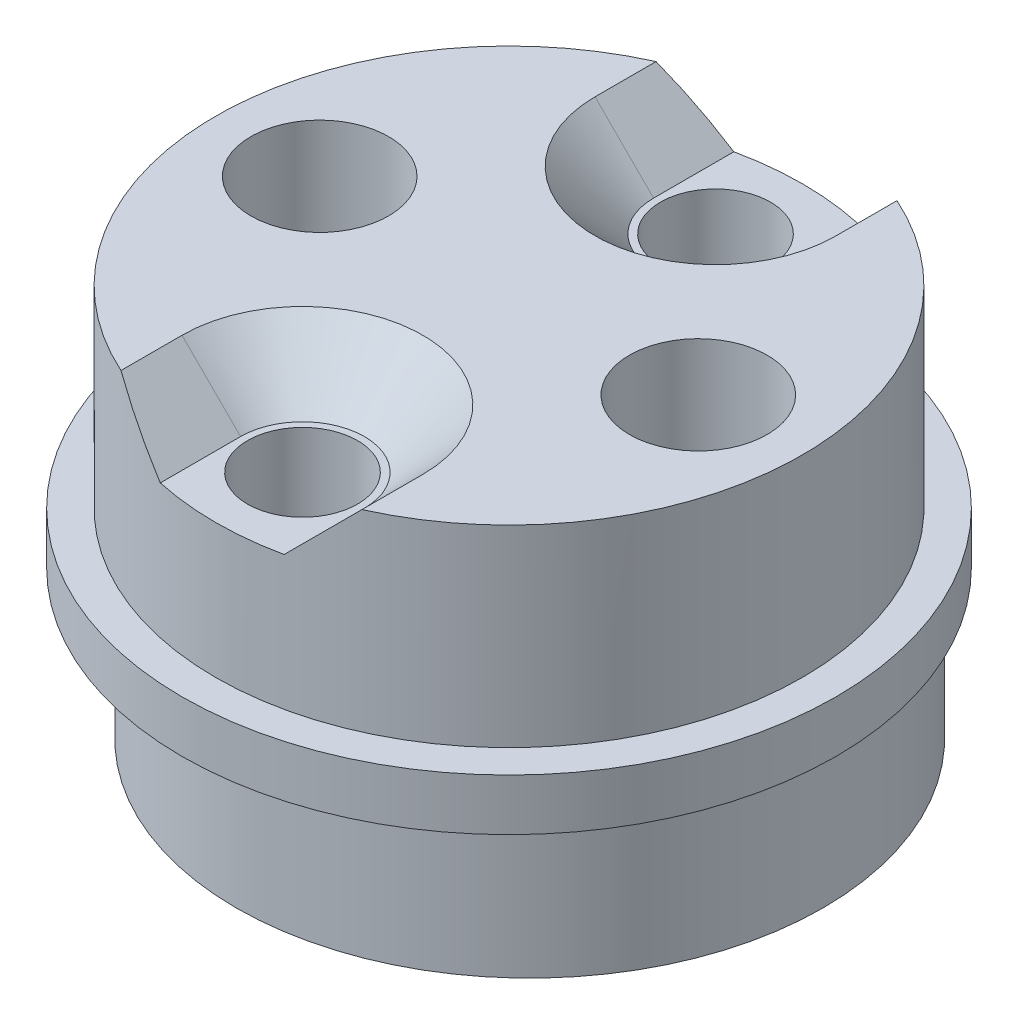
ISO-10303-21;
HEADER;
FILE_DESCRIPTION(('STEP AP214'),'2;1');
FILE_NAME('part.step','',(''),(''),'','','');
FILE_SCHEMA(('AUTOMOTIVE_DESIGN { 1 0 10303 214 1 1 1 1 }'));
ENDSEC;
DATA;
#1=APPLICATION_CONTEXT('core data for automotive mechanical design processes');
#2=APPLICATION_PROTOCOL_DEFINITION('international standard','automotive_design',2000,#1);
#3=PRODUCT_CONTEXT('',#1,'mechanical');
#4=PRODUCT('Part','Part','',(#3));
#5=PRODUCT_RELATED_PRODUCT_CATEGORY('part','',(#4));
#6=PRODUCT_DEFINITION_FORMATION('','',#4);
#7=PRODUCT_DEFINITION_CONTEXT('part definition',#1,'design');
#8=PRODUCT_DEFINITION('design','',#6,#7);
#9=PRODUCT_DEFINITION_SHAPE('','',#8);
#10=(LENGTH_UNIT() NAMED_UNIT(*) SI_UNIT(.MILLI.,.METRE.));
#11=(NAMED_UNIT(*) PLANE_ANGLE_UNIT() SI_UNIT($,.RADIAN.));
#12=(NAMED_UNIT(*) SI_UNIT($,.STERADIAN.) SOLID_ANGLE_UNIT());
#13=UNCERTAINTY_MEASURE_WITH_UNIT(LENGTH_MEASURE(1.E-05),#10,'distance_accuracy_value','');
#14=(GEOMETRIC_REPRESENTATION_CONTEXT(3) GLOBAL_UNCERTAINTY_ASSIGNED_CONTEXT((#13)) GLOBAL_UNIT_ASSIGNED_CONTEXT((#10,
#11,#12)) REPRESENTATION_CONTEXT('',''));
#15=CARTESIAN_POINT('',(0.,0.,0.));
#16=DIRECTION('',(0.,0.,1.));
#17=DIRECTION('',(1.,0.,0.));
#18=AXIS2_PLACEMENT_3D('',#15,#16,#17);
#19=CARTESIAN_POINT('',(1.2,4.,0.));
#20=DIRECTION('',(0.,1.,0.));
#21=DIRECTION('',(0.,0.,1.));
#22=AXIS2_PLACEMENT_3D('',#19,#20,#21);
#23=PLANE('',#22);
#24=CARTESIAN_POINT('',(6.1,4.,0.));
#25=DIRECTION('',(0.,1.,0.));
#26=DIRECTION('',(0.,0.,1.));
#27=AXIS2_PLACEMENT_3D('',#24,#25,#26);
#28=CIRCLE('',#27,1.55);
#29=CARTESIAN_POINT('',(6.1,4.,1.55));
#30=VERTEX_POINT('',#29);
#31=EDGE_CURVE('E189',#30,#30,#28,.F.);
#32=ORIENTED_EDGE('',*,*,#31,.F.);
#33=EDGE_LOOP('',(#32));
#34=FACE_BOUND('',#33,.T.);
#35=CARTESIAN_POINT('',(0.6,4.,6.));
#36=DIRECTION('',(0.,1.,0.));
#37=DIRECTION('',(0.,0.,1.));
#38=AXIS2_PLACEMENT_3D('',#35,#36,#37);
#39=CIRCLE('',#38,1.6);
#40=CARTESIAN_POINT('',(0.6,4.,7.6));
#41=VERTEX_POINT('',#40);
#42=EDGE_CURVE('E183',#41,#41,#39,.F.);
#43=ORIENTED_EDGE('',*,*,#42,.F.);
#44=EDGE_LOOP('',(#43));
#45=FACE_BOUND('',#44,.T.);
#46=CARTESIAN_POINT('',(0.6,4.,-6.));
#47=DIRECTION('',(0.,1.,0.));
#48=DIRECTION('',(0.,0.,1.));
#49=AXIS2_PLACEMENT_3D('',#46,#47,#48);
#50=CIRCLE('',#49,1.6);
#51=CARTESIAN_POINT('',(0.6,4.,-4.4));
#52=VERTEX_POINT('',#51);
#53=EDGE_CURVE('E180',#52,#52,#50,.F.);
#54=ORIENTED_EDGE('',*,*,#53,.F.);
#55=EDGE_LOOP('',(#54));
#56=FACE_BOUND('',#55,.T.);
#57=CARTESIAN_POINT('',(-4.9,4.,0.));
#58=DIRECTION('',(0.,1.,0.));
#59=DIRECTION('',(0.,0.,1.));
#60=AXIS2_PLACEMENT_3D('',#57,#58,#59);
#61=CIRCLE('',#60,1.55);
#62=CARTESIAN_POINT('',(-4.9,4.,1.55));
#63=VERTEX_POINT('',#62);
#64=EDGE_CURVE('E186',#63,#63,#61,.F.);
#65=ORIENTED_EDGE('',*,*,#64,.F.);
#66=EDGE_LOOP('',(#65));
#67=FACE_BOUND('',#66,.T.);
#68=CARTESIAN_POINT('',(1.2,4.,0.));
#69=DIRECTION('',(0.,1.,0.));
#70=DIRECTION('',(0.,0.,1.));
#71=AXIS2_PLACEMENT_3D('',#68,#69,#70);
#72=CIRCLE('',#71,8.525);
#73=CARTESIAN_POINT('',(1.2,4.,8.525));
#74=VERTEX_POINT('',#73);
#75=EDGE_CURVE('E243',#74,#74,#72,.T.);
#76=ORIENTED_EDGE('',*,*,#75,.F.);
#77=EDGE_LOOP('',(#76));
#78=FACE_BOUND('',#77,.T.);
#79=DIRECTION('',(0.,0.,-1.));
#80=VECTOR('',#79,1.);
#81=CARTESIAN_POINT('',(-1.8,4.,3.));
#82=LINE('',#81,#80);
#83=CARTESIAN_POINT('',(-1.8,4.,3.));
#84=VERTEX_POINT('',#83);
#85=CARTESIAN_POINT('',(-1.8,4.,-3.));
#86=VERTEX_POINT('',#85);
#87=EDGE_CURVE('E170',#84,#86,#82,.T.);
#88=ORIENTED_EDGE('',*,*,#87,.F.);
#89=DIRECTION('',(-1.,0.,0.));
#90=VECTOR('',#89,1.);
#91=CARTESIAN_POINT('',(-1.8,4.,3.));
#92=LINE('',#91,#90);
#93=CARTESIAN_POINT('',(4.2,4.,3.));
#94=VERTEX_POINT('',#93);
#95=EDGE_CURVE('E166',#94,#84,#92,.T.);
#96=ORIENTED_EDGE('',*,*,#95,.F.);
#97=DIRECTION('',(0.,0.,1.));
#98=VECTOR('',#97,1.);
#99=CARTESIAN_POINT('',(4.2,4.,3.));
#100=LINE('',#99,#98);
#101=CARTESIAN_POINT('',(4.2,4.,-3.));
#102=VERTEX_POINT('',#101);
#103=EDGE_CURVE('E150',#102,#94,#100,.T.);
#104=ORIENTED_EDGE('',*,*,#103,.F.);
#105=DIRECTION('',(1.,0.,0.));
#106=VECTOR('',#105,1.);
#107=CARTESIAN_POINT('',(-1.8,4.,-3.));
#108=LINE('',#107,#106);
#109=EDGE_CURVE('E163',#86,#102,#108,.T.);
#110=ORIENTED_EDGE('',*,*,#109,.F.);
#111=EDGE_LOOP('',(#88,#96,#104,#110));
#112=FACE_BOUND('',#111,.T.);
#113=ADVANCED_FACE('F41',(#34,#45,#56,#67,#78,#112),#23,.F.);
#114=CARTESIAN_POINT('',(6.1,19.4840620433566,0.));
#115=DIRECTION('',(0.,-1.,0.));
#116=DIRECTION('',(0.,0.,-1.));
#117=AXIS2_PLACEMENT_3D('',#114,#115,#116);
#118=CYLINDRICAL_SURFACE('',#117,1.55);
#119=ORIENTED_EDGE('',*,*,#31,.T.);
#120=EDGE_LOOP('',(#119));
#121=FACE_BOUND('',#120,.T.);
#122=CARTESIAN_POINT('',(6.1,11.1,0.));
#123=DIRECTION('',(0.,1.,0.));
#124=DIRECTION('',(0.,0.,1.));
#125=AXIS2_PLACEMENT_3D('',#122,#123,#124);
#126=CIRCLE('',#125,1.55);
#127=CARTESIAN_POINT('',(6.1,11.1,1.55));
#128=VERTEX_POINT('',#127);
#129=EDGE_CURVE('E252',#128,#128,#126,.F.);
#130=ORIENTED_EDGE('',*,*,#129,.F.);
#131=EDGE_LOOP('',(#130));
#132=FACE_BOUND('',#131,.T.);
#133=ADVANCED_FACE('F353',(#121,#132),#118,.F.);
#134=CARTESIAN_POINT('',(-4.9,19.4840620433566,0.));
#135=DIRECTION('',(0.,-1.,0.));
#136=DIRECTION('',(0.,0.,-1.));
#137=AXIS2_PLACEMENT_3D('',#134,#135,#136);
#138=CYLINDRICAL_SURFACE('',#137,1.55);
#139=ORIENTED_EDGE('',*,*,#64,.T.);
#140=EDGE_LOOP('',(#139));
#141=FACE_BOUND('',#140,.T.);
#142=CARTESIAN_POINT('',(-4.9,11.1,0.));
#143=DIRECTION('',(0.,1.,0.));
#144=DIRECTION('',(0.,0.,1.));
#145=AXIS2_PLACEMENT_3D('',#142,#143,#144);
#146=CIRCLE('',#145,1.55);
#147=CARTESIAN_POINT('',(-4.9,11.1,1.55));
#148=VERTEX_POINT('',#147);
#149=EDGE_CURVE('E221',#148,#148,#146,.F.);
#150=ORIENTED_EDGE('',*,*,#149,.F.);
#151=EDGE_LOOP('',(#150));
#152=FACE_BOUND('',#151,.T.);
#153=ADVANCED_FACE('F361',(#141,#152),#138,.F.);
#154=CARTESIAN_POINT('',(0.6,19.6254833995939,6.));
#155=DIRECTION('',(0.,-1.,0.));
#156=DIRECTION('',(0.,0.,-1.));
#157=AXIS2_PLACEMENT_3D('',#154,#155,#156);
#158=CYLINDRICAL_SURFACE('',#157,1.6);
#159=ORIENTED_EDGE('',*,*,#42,.T.);
#160=EDGE_LOOP('',(#159));
#161=FACE_BOUND('',#160,.T.);
#162=CARTESIAN_POINT('',(0.6,13.4,6.));
#163=DIRECTION('',(0.,1.,0.));
#164=DIRECTION('',(0.,0.,1.));
#165=AXIS2_PLACEMENT_3D('',#162,#163,#164);
#166=CIRCLE('',#165,1.6);
#167=CARTESIAN_POINT('',(0.6,13.4,7.6));
#168=VERTEX_POINT('',#167);
#169=EDGE_CURVE('E213',#168,#168,#166,.F.);
#170=ORIENTED_EDGE('',*,*,#169,.F.);
#171=EDGE_LOOP('',(#170));
#172=FACE_BOUND('',#171,.T.);
#173=ADVANCED_FACE('F521',(#161,#172),#158,.F.);
#174=CARTESIAN_POINT('',(0.6,19.6254833995939,-6.));
#175=DIRECTION('',(0.,-1.,0.));
#176=DIRECTION('',(0.,0.,-1.));
#177=AXIS2_PLACEMENT_3D('',#174,#175,#176);
#178=CYLINDRICAL_SURFACE('',#177,1.6);
#179=ORIENTED_EDGE('',*,*,#53,.T.);
#180=EDGE_LOOP('',(#179));
#181=FACE_BOUND('',#180,.T.);
#182=CARTESIAN_POINT('',(0.6,13.4,-6.));
#183=DIRECTION('',(0.,1.,0.));
#184=DIRECTION('',(0.,0.,1.));
#185=AXIS2_PLACEMENT_3D('',#182,#183,#184);
#186=CIRCLE('',#185,1.6);
#187=CARTESIAN_POINT('',(0.6,13.4,-4.4));
#188=VERTEX_POINT('',#187);
#189=EDGE_CURVE('E203',#188,#188,#186,.F.);
#190=ORIENTED_EDGE('',*,*,#189,.F.);
#191=EDGE_LOOP('',(#190));
#192=FACE_BOUND('',#191,.T.);
#193=ADVANCED_FACE('F372',(#181,#192),#178,.F.);
#194=CARTESIAN_POINT('',(1.2,8.,0.));
#195=DIRECTION('',(0.,-1.,0.));
#196=DIRECTION('',(0.,0.,-1.));
#197=AXIS2_PLACEMENT_3D('',#194,#195,#196);
#198=CYLINDRICAL_SURFACE('',#197,8.525);
#199=CARTESIAN_POINT('',(1.2,8.,0.));
#200=DIRECTION('',(0.,1.,0.));
#201=DIRECTION('',(0.,0.,1.));
#202=AXIS2_PLACEMENT_3D('',#199,#200,#201);
#203=CIRCLE('',#202,8.525);
#204=CARTESIAN_POINT('',(1.2,8.,8.525));
#205=VERTEX_POINT('',#204);
#206=EDGE_CURVE('E239',#205,#205,#203,.T.);
#207=ORIENTED_EDGE('',*,*,#206,.F.);
#208=EDGE_LOOP('',(#207));
#209=FACE_BOUND('',#208,.T.);
#210=ORIENTED_EDGE('',*,*,#75,.T.);
#211=EDGE_LOOP('',(#210));
#212=FACE_BOUND('',#211,.T.);
#213=ADVANCED_FACE('F370',(#209,#212),#198,.T.);
#214=CARTESIAN_POINT('',(0.6,9.5,0.));
#215=DIRECTION('',(0.,-1.,0.));
#216=DIRECTION('',(0.,0.,-1.));
#217=AXIS2_PLACEMENT_3D('',#214,#215,#216);
#218=CYLINDRICAL_SURFACE('',#217,9.5);
#219=CARTESIAN_POINT('',(0.6,9.5,0.));
#220=DIRECTION('',(0.,1.,0.));
#221=DIRECTION('',(0.,0.,1.));
#222=AXIS2_PLACEMENT_3D('',#219,#220,#221);
#223=CIRCLE('',#222,9.5);
#224=CARTESIAN_POINT('',(0.6,9.5,9.5));
#225=VERTEX_POINT('',#224);
#226=EDGE_CURVE('E240',#225,#225,#223,.T.);
#227=ORIENTED_EDGE('',*,*,#226,.F.);
#228=EDGE_LOOP('',(#227));
#229=FACE_BOUND('',#228,.T.);
#230=CARTESIAN_POINT('',(0.6,8.,0.));
#231=DIRECTION('',(0.,1.,0.));
#232=DIRECTION('',(0.,0.,1.));
#233=AXIS2_PLACEMENT_3D('',#230,#231,#232);
#234=CIRCLE('',#233,9.5);
#235=CARTESIAN_POINT('',(0.6,8.,9.5));
#236=VERTEX_POINT('',#235);
#237=EDGE_CURVE('E233',#236,#236,#234,.T.);
#238=ORIENTED_EDGE('',*,*,#237,.T.);
#239=EDGE_LOOP('',(#238));
#240=FACE_BOUND('',#239,.T.);
#241=ADVANCED_FACE('F368',(#229,#240),#218,.T.);
#242=CARTESIAN_POINT('',(0.6,9.5,0.));
#243=DIRECTION('',(0.,1.,0.));
#244=DIRECTION('',(0.,0.,1.));
#245=AXIS2_PLACEMENT_3D('',#242,#243,#244);
#246=PLANE('',#245);
#247=CARTESIAN_POINT('',(0.6,9.5,0.));
#248=DIRECTION('',(0.,1.,0.));
#249=DIRECTION('',(0.,0.,1.));
#250=AXIS2_PLACEMENT_3D('',#247,#248,#249);
#251=CIRCLE('',#250,8.525);
#252=CARTESIAN_POINT('',(0.6,9.5,8.525));
#253=VERTEX_POINT('',#252);
#254=EDGE_CURVE('E235',#253,#253,#251,.T.);
#255=ORIENTED_EDGE('',*,*,#254,.F.);
#256=EDGE_LOOP('',(#255));
#257=FACE_BOUND('',#256,.T.);
#258=ORIENTED_EDGE('',*,*,#226,.T.);
#259=EDGE_LOOP('',(#258));
#260=FACE_BOUND('',#259,.T.);
#261=ADVANCED_FACE('F611',(#257,#260),#246,.T.);
#262=CARTESIAN_POINT('',(0.6,8.,0.));
#263=DIRECTION('',(0.,1.,0.));
#264=DIRECTION('',(0.,0.,1.));
#265=AXIS2_PLACEMENT_3D('',#262,#263,#264);
#266=PLANE('',#265);
#267=ORIENTED_EDGE('',*,*,#206,.T.);
#268=EDGE_LOOP('',(#267));
#269=FACE_BOUND('',#268,.T.);
#270=ORIENTED_EDGE('',*,*,#237,.F.);
#271=EDGE_LOOP('',(#270));
#272=FACE_BOUND('',#271,.T.);
#273=ADVANCED_FACE('F603',(#269,#272),#266,.F.);
#274=CARTESIAN_POINT('',(0.6,15.1,0.));
#275=DIRECTION('',(0.,-1.,0.));
#276=DIRECTION('',(0.,0.,-1.));
#277=AXIS2_PLACEMENT_3D('',#274,#275,#276);
#278=CYLINDRICAL_SURFACE('',#277,8.525);
#279=CARTESIAN_POINT('',(0.6,15.1,0.));
#280=DIRECTION('',(0.,1.,0.));
#281=DIRECTION('',(0.,0.,1.));
#282=AXIS2_PLACEMENT_3D('',#279,#280,#281);
#283=CIRCLE('',#282,8.525);
#284=CARTESIAN_POINT('',(4.1,15.1,7.77339211670169));
#285=VERTEX_POINT('',#284);
#286=CARTESIAN_POINT('',(4.1,15.1,-7.77339211670169));
#287=VERTEX_POINT('',#286);
#288=EDGE_CURVE('E230',#285,#287,#283,.T.);
#289=ORIENTED_EDGE('',*,*,#288,.F.);
#290=CARTESIAN_POINT('',(0.6,11.6,0.));
#291=DIRECTION('',(0.707106781186543,-0.707106781186552,0.));
#292=DIRECTION('',(-0.707106781186552,-0.707106781186543,0.));
#293=AXIS2_PLACEMENT_3D('',#290,#291,#292);
#294=ELLIPSE('',#293,12.0561706192306,8.525);
#295=CARTESIAN_POINT('',(2.39999999999998,13.4,8.33280414986456));
#296=VERTEX_POINT('',#295);
#297=EDGE_CURVE('E297',#285,#296,#294,.T.);
#298=ORIENTED_EDGE('',*,*,#297,.T.);
#299=CARTESIAN_POINT('',(0.6,13.4,0.));
#300=DIRECTION('',(0.,1.,0.));
#301=DIRECTION('',(0.,0.,1.));
#302=AXIS2_PLACEMENT_3D('',#299,#300,#301);
#303=CIRCLE('',#302,8.525);
#304=CARTESIAN_POINT('',(-1.19999999999998,13.4,8.33280414986456));
#305=VERTEX_POINT('',#304);
#306=EDGE_CURVE('E214',#305,#296,#303,.T.);
#307=ORIENTED_EDGE('',*,*,#306,.F.);
#308=CARTESIAN_POINT('',(0.6,11.6,0.));
#309=DIRECTION('',(-0.707106781186543,-0.707106781186552,0.));
#310=DIRECTION('',(0.707106781186552,-0.707106781186543,0.));
#311=AXIS2_PLACEMENT_3D('',#308,#309,#310);
#312=ELLIPSE('',#311,12.0561706192306,8.525);
#313=CARTESIAN_POINT('',(-2.9,15.1,7.77339211670169));
#314=VERTEX_POINT('',#313);
#315=EDGE_CURVE('E299',#305,#314,#312,.T.);
#316=ORIENTED_EDGE('',*,*,#315,.T.);
#317=CARTESIAN_POINT('',(-2.9,15.1,-7.77339211670169));
#318=VERTEX_POINT('',#317);
#319=EDGE_CURVE('E234',#318,#314,#283,.T.);
#320=ORIENTED_EDGE('',*,*,#319,.F.);
#321=CARTESIAN_POINT('',(0.6,11.6,0.));
#322=DIRECTION('',(-0.707106781186543,-0.707106781186552,0.));
#323=DIRECTION('',(0.707106781186552,-0.707106781186543,0.));
#324=AXIS2_PLACEMENT_3D('',#321,#322,#323);
#325=ELLIPSE('',#324,12.0561706192306,8.525);
#326=CARTESIAN_POINT('',(-1.19999999999998,13.4,-8.33280414986456));
#327=VERTEX_POINT('',#326);
#328=EDGE_CURVE('E51',#318,#327,#325,.T.);
#329=ORIENTED_EDGE('',*,*,#328,.T.);
#330=CARTESIAN_POINT('',(0.6,13.4,0.));
#331=DIRECTION('',(0.,1.,0.));
#332=DIRECTION('',(0.,0.,1.));
#333=AXIS2_PLACEMENT_3D('',#330,#331,#332);
#334=CIRCLE('',#333,8.525);
#335=CARTESIAN_POINT('',(2.39999999999998,13.4,-8.33280414986456));
#336=VERTEX_POINT('',#335);
#337=EDGE_CURVE('E210',#336,#327,#334,.T.);
#338=ORIENTED_EDGE('',*,*,#337,.F.);
#339=CARTESIAN_POINT('',(0.6,11.6,0.));
#340=DIRECTION('',(0.707106781186543,-0.707106781186552,0.));
#341=DIRECTION('',(-0.707106781186552,-0.707106781186543,0.));
#342=AXIS2_PLACEMENT_3D('',#339,#340,#341);
#343=ELLIPSE('',#342,12.0561706192306,8.525);
#344=EDGE_CURVE('E11',#336,#287,#343,.T.);
#345=ORIENTED_EDGE('',*,*,#344,.T.);
#346=EDGE_LOOP('',(#289,#298,#307,#316,#320,#329,#338,#345));
#347=FACE_BOUND('',#346,.T.);
#348=ORIENTED_EDGE('',*,*,#254,.T.);
#349=EDGE_LOOP('',(#348));
#350=FACE_BOUND('',#349,.T.);
#351=ADVANCED_FACE('F316',(#347,#350),#278,.T.);
#352=CARTESIAN_POINT('',(0.6,15.1,0.));
#353=DIRECTION('',(0.,1.,0.));
#354=DIRECTION('',(0.,0.,1.));
#355=AXIS2_PLACEMENT_3D('',#352,#353,#354);
#356=PLANE('',#355);
#357=DIRECTION('',(0.,0.,-1.));
#358=VECTOR('',#357,1.);
#359=CARTESIAN_POINT('',(4.1,15.1,6.));
#360=LINE('',#359,#358);
#361=CARTESIAN_POINT('',(4.1,15.1,6.));
#362=VERTEX_POINT('',#361);
#363=EDGE_CURVE('E200',#285,#362,#360,.T.);
#364=ORIENTED_EDGE('',*,*,#363,.F.);
#365=ORIENTED_EDGE('',*,*,#288,.T.);
#366=DIRECTION('',(0.,0.,-1.));
#367=VECTOR('',#366,1.);
#368=CARTESIAN_POINT('',(4.1,15.1,-6.));
#369=LINE('',#368,#367);
#370=CARTESIAN_POINT('',(4.1,15.1,-6.));
#371=VERTEX_POINT('',#370);
#372=EDGE_CURVE('E205',#371,#287,#369,.T.);
#373=ORIENTED_EDGE('',*,*,#372,.F.);
#374=CARTESIAN_POINT('',(0.6,15.1,-6.));
#375=DIRECTION('',(0.,1.,0.));
#376=DIRECTION('',(0.,0.,1.));
#377=AXIS2_PLACEMENT_3D('',#374,#375,#376);
#378=CIRCLE('',#377,3.5);
#379=CARTESIAN_POINT('',(-2.9,15.1,-6.));
#380=VERTEX_POINT('',#379);
#381=EDGE_CURVE('E197',#380,#371,#378,.T.);
#382=ORIENTED_EDGE('',*,*,#381,.F.);
#383=DIRECTION('',(0.,0.,1.));
#384=VECTOR('',#383,1.);
#385=CARTESIAN_POINT('',(-2.9,15.1,-6.));
#386=LINE('',#385,#384);
#387=EDGE_CURVE('E192',#318,#380,#386,.T.);
#388=ORIENTED_EDGE('',*,*,#387,.F.);
#389=ORIENTED_EDGE('',*,*,#319,.T.);
#390=DIRECTION('',(0.,0.,1.));
#391=VECTOR('',#390,1.);
#392=CARTESIAN_POINT('',(-2.9,15.1,6.));
#393=LINE('',#392,#391);
#394=CARTESIAN_POINT('',(-2.9,15.1,6.));
#395=VERTEX_POINT('',#394);
#396=EDGE_CURVE('E196',#395,#314,#393,.T.);
#397=ORIENTED_EDGE('',*,*,#396,.F.);
#398=CARTESIAN_POINT('',(0.6,15.1,6.));
#399=DIRECTION('',(0.,1.,0.));
#400=DIRECTION('',(0.,0.,1.));
#401=AXIS2_PLACEMENT_3D('',#398,#399,#400);
#402=CIRCLE('',#401,3.5);
#403=EDGE_CURVE('E193',#362,#395,#402,.T.);
#404=ORIENTED_EDGE('',*,*,#403,.F.);
#405=EDGE_LOOP('',(#364,#365,#373,#382,#388,#389,#397,#404));
#406=FACE_BOUND('',#405,.T.);
#407=CARTESIAN_POINT('',(-4.9,15.1,0.));
#408=DIRECTION('',(0.,1.,0.));
#409=DIRECTION('',(0.,0.,1.));
#410=AXIS2_PLACEMENT_3D('',#407,#408,#409);
#411=CIRCLE('',#410,2.);
#412=CARTESIAN_POINT('',(-4.9,15.1,2.));
#413=VERTEX_POINT('',#412);
#414=EDGE_CURVE('E222',#413,#413,#411,.T.);
#415=ORIENTED_EDGE('',*,*,#414,.F.);
#416=EDGE_LOOP('',(#415));
#417=FACE_BOUND('',#416,.T.);
#418=CARTESIAN_POINT('',(6.1,15.1,0.));
#419=DIRECTION('',(0.,1.,0.));
#420=DIRECTION('',(0.,0.,1.));
#421=AXIS2_PLACEMENT_3D('',#418,#419,#420);
#422=CIRCLE('',#421,2.);
#423=CARTESIAN_POINT('',(6.1,15.1,2.));
#424=VERTEX_POINT('',#423);
#425=EDGE_CURVE('E225',#424,#424,#422,.T.);
#426=ORIENTED_EDGE('',*,*,#425,.F.);
#427=EDGE_LOOP('',(#426));
#428=FACE_BOUND('',#427,.T.);
#429=ADVANCED_FACE('F323',(#406,#417,#428),#356,.T.);
#430=CARTESIAN_POINT('',(-4.9,11.1,0.));
#431=DIRECTION('',(0.,1.,0.));
#432=DIRECTION('',(0.,0.,1.));
#433=AXIS2_PLACEMENT_3D('',#430,#431,#432);
#434=PLANE('',#433);
#435=CARTESIAN_POINT('',(-4.9,11.1,0.));
#436=DIRECTION('',(0.,1.,0.));
#437=DIRECTION('',(0.,0.,1.));
#438=AXIS2_PLACEMENT_3D('',#435,#436,#437);
#439=CIRCLE('',#438,2.);
#440=CARTESIAN_POINT('',(-4.9,11.1,2.));
#441=VERTEX_POINT('',#440);
#442=EDGE_CURVE('E218',#441,#441,#439,.T.);
#443=ORIENTED_EDGE('',*,*,#442,.T.);
#444=EDGE_LOOP('',(#443));
#445=FACE_BOUND('',#444,.T.);
#446=ORIENTED_EDGE('',*,*,#149,.T.);
#447=EDGE_LOOP('',(#446));
#448=FACE_BOUND('',#447,.T.);
#449=ADVANCED_FACE('F580',(#445,#448),#434,.T.);
#450=CARTESIAN_POINT('',(-4.9,11.1,0.));
#451=DIRECTION('',(0.,1.,0.));
#452=DIRECTION('',(0.,0.,1.));
#453=AXIS2_PLACEMENT_3D('',#450,#451,#452);
#454=CYLINDRICAL_SURFACE('',#453,2.);
#455=ORIENTED_EDGE('',*,*,#442,.F.);
#456=EDGE_LOOP('',(#455));
#457=FACE_BOUND('',#456,.T.);
#458=ORIENTED_EDGE('',*,*,#414,.T.);
#459=EDGE_LOOP('',(#458));
#460=FACE_BOUND('',#459,.T.);
#461=ADVANCED_FACE('F571',(#457,#460),#454,.F.);
#462=CARTESIAN_POINT('',(6.1,11.1,0.));
#463=DIRECTION('',(0.,1.,0.));
#464=DIRECTION('',(0.,0.,1.));
#465=AXIS2_PLACEMENT_3D('',#462,#463,#464);
#466=PLANE('',#465);
#467=CARTESIAN_POINT('',(6.1,11.1,0.));
#468=DIRECTION('',(0.,1.,0.));
#469=DIRECTION('',(0.,0.,1.));
#470=AXIS2_PLACEMENT_3D('',#467,#468,#469);
#471=CIRCLE('',#470,2.);
#472=CARTESIAN_POINT('',(6.1,11.1,2.));
#473=VERTEX_POINT('',#472);
#474=EDGE_CURVE('E217',#473,#473,#471,.T.);
#475=ORIENTED_EDGE('',*,*,#474,.T.);
#476=EDGE_LOOP('',(#475));
#477=FACE_BOUND('',#476,.T.);
#478=ORIENTED_EDGE('',*,*,#129,.T.);
#479=EDGE_LOOP('',(#478));
#480=FACE_BOUND('',#479,.T.);
#481=ADVANCED_FACE('F562',(#477,#480),#466,.T.);
#482=CARTESIAN_POINT('',(6.1,11.1,0.));
#483=DIRECTION('',(0.,1.,0.));
#484=DIRECTION('',(0.,0.,1.));
#485=AXIS2_PLACEMENT_3D('',#482,#483,#484);
#486=CYLINDRICAL_SURFACE('',#485,2.);
#487=ORIENTED_EDGE('',*,*,#474,.F.);
#488=EDGE_LOOP('',(#487));
#489=FACE_BOUND('',#488,.T.);
#490=ORIENTED_EDGE('',*,*,#425,.T.);
#491=EDGE_LOOP('',(#490));
#492=FACE_BOUND('',#491,.T.);
#493=ADVANCED_FACE('F536',(#489,#492),#486,.F.);
#494=CARTESIAN_POINT('',(0.6,13.4,-6.));
#495=DIRECTION('',(0.,1.,0.));
#496=DIRECTION('',(0.,0.,1.));
#497=AXIS2_PLACEMENT_3D('',#494,#495,#496);
#498=PLANE('',#497);
#499=ORIENTED_EDGE('',*,*,#337,.T.);
#500=DIRECTION('',(0.,0.,1.));
#501=VECTOR('',#500,1.);
#502=CARTESIAN_POINT('',(-1.19999999999998,13.4,-6.));
#503=LINE('',#502,#501);
#504=CARTESIAN_POINT('',(-1.19999999999998,13.4,-6.));
#505=VERTEX_POINT('',#504);
#506=EDGE_CURVE('E295',#327,#505,#503,.T.);
#507=ORIENTED_EDGE('',*,*,#506,.T.);
#508=CARTESIAN_POINT('',(0.6,13.4,-6.));
#509=DIRECTION('',(0.,1.,0.));
#510=DIRECTION('',(0.,0.,1.));
#511=AXIS2_PLACEMENT_3D('',#508,#509,#510);
#512=CIRCLE('',#511,1.79999999999998);
#513=CARTESIAN_POINT('',(2.39999999999998,13.4,-6.));
#514=VERTEX_POINT('',#513);
#515=EDGE_CURVE('E59',#505,#514,#512,.T.);
#516=ORIENTED_EDGE('',*,*,#515,.T.);
#517=DIRECTION('',(0.,0.,-1.));
#518=VECTOR('',#517,1.);
#519=CARTESIAN_POINT('',(2.39999999999998,13.4,-6.));
#520=LINE('',#519,#518);
#521=EDGE_CURVE('E293',#514,#336,#520,.T.);
#522=ORIENTED_EDGE('',*,*,#521,.T.);
#523=EDGE_LOOP('',(#499,#507,#516,#522));
#524=FACE_BOUND('',#523,.T.);
#525=ORIENTED_EDGE('',*,*,#189,.T.);
#526=EDGE_LOOP('',(#525));
#527=FACE_BOUND('',#526,.T.);
#528=ADVANCED_FACE('F312',(#524,#527),#498,.T.);
#529=CARTESIAN_POINT('',(0.6,13.4,6.));
#530=DIRECTION('',(0.,1.,0.));
#531=DIRECTION('',(0.,0.,1.));
#532=AXIS2_PLACEMENT_3D('',#529,#530,#531);
#533=PLANE('',#532);
#534=ORIENTED_EDGE('',*,*,#306,.T.);
#535=DIRECTION('',(0.,0.,-1.));
#536=VECTOR('',#535,1.);
#537=CARTESIAN_POINT('',(2.39999999999998,13.4,6.));
#538=LINE('',#537,#536);
#539=CARTESIAN_POINT('',(2.39999999999998,13.4,6.));
#540=VERTEX_POINT('',#539);
#541=EDGE_CURVE('E289',#296,#540,#538,.T.);
#542=ORIENTED_EDGE('',*,*,#541,.T.);
#543=CARTESIAN_POINT('',(0.6,13.4,6.));
#544=DIRECTION('',(0.,1.,0.));
#545=DIRECTION('',(0.,0.,1.));
#546=AXIS2_PLACEMENT_3D('',#543,#544,#545);
#547=CIRCLE('',#546,1.79999999999998);
#548=CARTESIAN_POINT('',(-1.19999999999998,13.4,6.));
#549=VERTEX_POINT('',#548);
#550=EDGE_CURVE('E275',#540,#549,#547,.T.);
#551=ORIENTED_EDGE('',*,*,#550,.T.);
#552=DIRECTION('',(0.,0.,1.));
#553=VECTOR('',#552,1.);
#554=CARTESIAN_POINT('',(-1.19999999999998,13.4,6.));
#555=LINE('',#554,#553);
#556=EDGE_CURVE('E287',#549,#305,#555,.T.);
#557=ORIENTED_EDGE('',*,*,#556,.T.);
#558=EDGE_LOOP('',(#534,#542,#551,#557));
#559=FACE_BOUND('',#558,.T.);
#560=ORIENTED_EDGE('',*,*,#169,.T.);
#561=EDGE_LOOP('',(#560));
#562=FACE_BOUND('',#561,.T.);
#563=ADVANCED_FACE('F333',(#559,#562),#533,.T.);
#564=CARTESIAN_POINT('',(-1.8,1.,3.));
#565=DIRECTION('',(1.,0.,0.));
#566=DIRECTION('',(0.,0.,-1.));
#567=AXIS2_PLACEMENT_3D('',#564,#565,#566);
#568=PLANE('',#567);
#569=DIRECTION('',(0.,1.,0.));
#570=VECTOR('',#569,1.);
#571=CARTESIAN_POINT('',(-1.8,1.,-3.));
#572=LINE('',#571,#570);
#573=CARTESIAN_POINT('',(-1.8,1.6,-3.));
#574=VERTEX_POINT('',#573);
#575=EDGE_CURVE('E156',#574,#86,#572,.T.);
#576=ORIENTED_EDGE('',*,*,#575,.F.);
#577=DIRECTION('',(0.,0.,-1.));
#578=VECTOR('',#577,1.);
#579=CARTESIAN_POINT('',(-1.8,1.6,3.));
#580=LINE('',#579,#578);
#581=CARTESIAN_POINT('',(-1.8,1.6,3.));
#582=VERTEX_POINT('',#581);
#583=EDGE_CURVE('E273',#574,#582,#580,.F.);
#584=ORIENTED_EDGE('',*,*,#583,.T.);
#585=DIRECTION('',(0.,1.,0.));
#586=VECTOR('',#585,1.);
#587=CARTESIAN_POINT('',(-1.8,1.,3.));
#588=LINE('',#587,#586);
#589=EDGE_CURVE('E176',#582,#84,#588,.T.);
#590=ORIENTED_EDGE('',*,*,#589,.T.);
#591=ORIENTED_EDGE('',*,*,#87,.T.);
#592=EDGE_LOOP('',(#576,#584,#590,#591));
#593=FACE_BOUND('',#592,.T.);
#594=ADVANCED_FACE('F493',(#593),#568,.F.);
#595=CARTESIAN_POINT('',(-1.8,1.,-3.));
#596=DIRECTION('',(0.,0.,1.));
#597=DIRECTION('',(1.,0.,0.));
#598=AXIS2_PLACEMENT_3D('',#595,#596,#597);
#599=PLANE('',#598);
#600=DIRECTION('',(0.,1.,0.));
#601=VECTOR('',#600,1.);
#602=CARTESIAN_POINT('',(4.2,1.,-3.));
#603=LINE('',#602,#601);
#604=CARTESIAN_POINT('',(4.2,1.6,-3.));
#605=VERTEX_POINT('',#604);
#606=EDGE_CURVE('E146',#605,#102,#603,.T.);
#607=ORIENTED_EDGE('',*,*,#606,.F.);
#608=DIRECTION('',(1.,0.,0.));
#609=VECTOR('',#608,1.);
#610=CARTESIAN_POINT('',(-1.8,1.6,-3.));
#611=LINE('',#610,#609);
#612=EDGE_CURVE('E271',#605,#574,#611,.F.);
#613=ORIENTED_EDGE('',*,*,#612,.T.);
#614=ORIENTED_EDGE('',*,*,#575,.T.);
#615=ORIENTED_EDGE('',*,*,#109,.T.);
#616=EDGE_LOOP('',(#607,#613,#614,#615));
#617=FACE_BOUND('',#616,.T.);
#618=ADVANCED_FACE('F168',(#617),#599,.F.);
#619=CARTESIAN_POINT('',(4.2,1.,3.));
#620=DIRECTION('',(-1.,0.,0.));
#621=DIRECTION('',(0.,0.,1.));
#622=AXIS2_PLACEMENT_3D('',#619,#620,#621);
#623=PLANE('',#622);
#624=DIRECTION('',(0.,1.,0.));
#625=VECTOR('',#624,1.);
#626=CARTESIAN_POINT('',(4.2,1.,3.));
#627=LINE('',#626,#625);
#628=CARTESIAN_POINT('',(4.2,1.6,3.));
#629=VERTEX_POINT('',#628);
#630=EDGE_CURVE('E157',#629,#94,#627,.T.);
#631=ORIENTED_EDGE('',*,*,#630,.F.);
#632=DIRECTION('',(0.,0.,1.));
#633=VECTOR('',#632,1.);
#634=CARTESIAN_POINT('',(4.2,1.6,-3.));
#635=LINE('',#634,#633);
#636=EDGE_CURVE('E152',#629,#605,#635,.F.);
#637=ORIENTED_EDGE('',*,*,#636,.T.);
#638=ORIENTED_EDGE('',*,*,#606,.T.);
#639=ORIENTED_EDGE('',*,*,#103,.T.);
#640=EDGE_LOOP('',(#631,#637,#638,#639));
#641=FACE_BOUND('',#640,.T.);
#642=ADVANCED_FACE('F149',(#641),#623,.F.);
#643=CARTESIAN_POINT('',(-1.8,1.,3.));
#644=DIRECTION('',(0.,0.,-1.));
#645=DIRECTION('',(-1.,0.,0.));
#646=AXIS2_PLACEMENT_3D('',#643,#644,#645);
#647=PLANE('',#646);
#648=ORIENTED_EDGE('',*,*,#589,.F.);
#649=DIRECTION('',(-1.,0.,0.));
#650=VECTOR('',#649,1.);
#651=CARTESIAN_POINT('',(4.2,1.6,3.));
#652=LINE('',#651,#650);
#653=EDGE_CURVE('E267',#582,#629,#652,.F.);
#654=ORIENTED_EDGE('',*,*,#653,.T.);
#655=ORIENTED_EDGE('',*,*,#630,.T.);
#656=ORIENTED_EDGE('',*,*,#95,.T.);
#657=EDGE_LOOP('',(#648,#654,#655,#656));
#658=FACE_BOUND('',#657,.T.);
#659=ADVANCED_FACE('F466',(#658),#647,.F.);
#660=CARTESIAN_POINT('',(0.,1.,0.));
#661=DIRECTION('',(0.,-1.,0.));
#662=DIRECTION('',(0.,0.,-1.));
#663=AXIS2_PLACEMENT_3D('',#660,#661,#662);
#664=PLANE('',#663);
#665=DIRECTION('',(0.,0.,1.));
#666=VECTOR('',#665,1.);
#667=CARTESIAN_POINT('',(3.6,1.,3.));
#668=LINE('',#667,#666);
#669=CARTESIAN_POINT('',(3.6,1.,-2.4));
#670=VERTEX_POINT('',#669);
#671=CARTESIAN_POINT('',(3.6,1.,2.4));
#672=VERTEX_POINT('',#671);
#673=EDGE_CURVE('E262',#670,#672,#668,.T.);
#674=ORIENTED_EDGE('',*,*,#673,.T.);
#675=DIRECTION('',(-1.,0.,0.));
#676=VECTOR('',#675,1.);
#677=CARTESIAN_POINT('',(-1.8,1.,2.4));
#678=LINE('',#677,#676);
#679=CARTESIAN_POINT('',(-1.2,1.,2.4));
#680=VERTEX_POINT('',#679);
#681=EDGE_CURVE('E264',#672,#680,#678,.T.);
#682=ORIENTED_EDGE('',*,*,#681,.T.);
#683=DIRECTION('',(0.,0.,-1.));
#684=VECTOR('',#683,1.);
#685=CARTESIAN_POINT('',(-1.2,1.,-3.));
#686=LINE('',#685,#684);
#687=CARTESIAN_POINT('',(-1.2,1.,-2.4));
#688=VERTEX_POINT('',#687);
#689=EDGE_CURVE('E238',#680,#688,#686,.T.);
#690=ORIENTED_EDGE('',*,*,#689,.T.);
#691=DIRECTION('',(1.,0.,0.));
#692=VECTOR('',#691,1.);
#693=CARTESIAN_POINT('',(4.2,1.,-2.4));
#694=LINE('',#693,#692);
#695=EDGE_CURVE('E260',#688,#670,#694,.T.);
#696=ORIENTED_EDGE('',*,*,#695,.T.);
#697=EDGE_LOOP('',(#674,#682,#690,#696));
#698=FACE_BOUND('',#697,.T.);
#699=ADVANCED_FACE('F387',(#698),#664,.T.);
#700=CARTESIAN_POINT('',(0.,1.6,-2.4));
#701=DIRECTION('',(-1.,0.,0.));
#702=DIRECTION('',(0.,0.,1.));
#703=AXIS2_PLACEMENT_3D('',#700,#701,#702);
#704=CYLINDRICAL_SURFACE('',#703,0.6);
#705=CARTESIAN_POINT('',(-1.2,1.6,-2.4));
#706=DIRECTION('',(-0.707106781186547,0.,0.707106781186547));
#707=DIRECTION('',(0.707106781186547,0.,0.707106781186547));
#708=AXIS2_PLACEMENT_3D('',#705,#706,#707);
#709=ELLIPSE('',#708,0.848528137423857,0.6);
#710=EDGE_CURVE('E281',#574,#688,#709,.T.);
#711=ORIENTED_EDGE('',*,*,#710,.F.);
#712=ORIENTED_EDGE('',*,*,#612,.F.);
#713=CARTESIAN_POINT('',(3.6,1.6,-2.4));
#714=DIRECTION('',(-0.707106781186547,0.,-0.707106781186547));
#715=DIRECTION('',(-0.707106781186547,0.,0.707106781186547));
#716=AXIS2_PLACEMENT_3D('',#713,#714,#715);
#717=ELLIPSE('',#716,0.848528137423857,0.6);
#718=EDGE_CURVE('E172',#670,#605,#717,.F.);
#719=ORIENTED_EDGE('',*,*,#718,.F.);
#720=ORIENTED_EDGE('',*,*,#695,.F.);
#721=EDGE_LOOP('',(#711,#712,#719,#720));
#722=FACE_BOUND('',#721,.T.);
#723=ADVANCED_FACE('F384',(#722),#704,.T.);
#724=CARTESIAN_POINT('',(3.6,1.6,0.));
#725=DIRECTION('',(0.,0.,-1.));
#726=DIRECTION('',(-1.,0.,0.));
#727=AXIS2_PLACEMENT_3D('',#724,#725,#726);
#728=CYLINDRICAL_SURFACE('',#727,0.6);
#729=ORIENTED_EDGE('',*,*,#718,.T.);
#730=ORIENTED_EDGE('',*,*,#636,.F.);
#731=CARTESIAN_POINT('',(3.6,1.6,2.4));
#732=DIRECTION('',(0.707106781186547,0.,-0.707106781186547));
#733=DIRECTION('',(-0.707106781186547,0.,-0.707106781186547));
#734=AXIS2_PLACEMENT_3D('',#731,#732,#733);
#735=ELLIPSE('',#734,0.848528137423857,0.6);
#736=EDGE_CURVE('E278',#672,#629,#735,.F.);
#737=ORIENTED_EDGE('',*,*,#736,.F.);
#738=ORIENTED_EDGE('',*,*,#673,.F.);
#739=EDGE_LOOP('',(#729,#730,#737,#738));
#740=FACE_BOUND('',#739,.T.);
#741=ADVANCED_FACE('F380',(#740),#728,.T.);
#742=CARTESIAN_POINT('',(-1.2,1.6,0.));
#743=DIRECTION('',(0.,0.,1.));
#744=DIRECTION('',(1.,0.,0.));
#745=AXIS2_PLACEMENT_3D('',#742,#743,#744);
#746=CYLINDRICAL_SURFACE('',#745,0.6);
#747=ORIENTED_EDGE('',*,*,#710,.T.);
#748=ORIENTED_EDGE('',*,*,#689,.F.);
#749=CARTESIAN_POINT('',(-1.2,1.6,2.4));
#750=DIRECTION('',(0.707106781186547,0.,0.707106781186547));
#751=DIRECTION('',(-0.707106781186547,0.,0.707106781186547));
#752=AXIS2_PLACEMENT_3D('',#749,#750,#751);
#753=ELLIPSE('',#752,0.848528137423857,0.6);
#754=EDGE_CURVE('E276',#582,#680,#753,.T.);
#755=ORIENTED_EDGE('',*,*,#754,.F.);
#756=ORIENTED_EDGE('',*,*,#583,.F.);
#757=EDGE_LOOP('',(#747,#748,#755,#756));
#758=FACE_BOUND('',#757,.T.);
#759=ADVANCED_FACE('F376',(#758),#746,.T.);
#760=CARTESIAN_POINT('',(0.,1.6,2.4));
#761=DIRECTION('',(1.,0.,0.));
#762=DIRECTION('',(0.,0.,-1.));
#763=AXIS2_PLACEMENT_3D('',#760,#761,#762);
#764=CYLINDRICAL_SURFACE('',#763,0.6);
#765=ORIENTED_EDGE('',*,*,#736,.T.);
#766=ORIENTED_EDGE('',*,*,#653,.F.);
#767=ORIENTED_EDGE('',*,*,#754,.T.);
#768=ORIENTED_EDGE('',*,*,#681,.F.);
#769=EDGE_LOOP('',(#765,#766,#767,#768));
#770=FACE_BOUND('',#769,.T.);
#771=ADVANCED_FACE('F349',(#770),#764,.T.);
#772=CARTESIAN_POINT('',(-1.19999999999998,13.4,6.));
#773=DIRECTION('',(-0.707106781186543,-0.707106781186552,0.));
#774=DIRECTION('',(0.,0.,1.));
#775=AXIS2_PLACEMENT_3D('',#772,#773,#774);
#776=PLANE('',#775);
#777=ORIENTED_EDGE('',*,*,#315,.F.);
#778=ORIENTED_EDGE('',*,*,#556,.F.);
#779=DIRECTION('',(0.707106781186552,-0.707106781186543,0.));
#780=VECTOR('',#779,1.);
#781=CARTESIAN_POINT('',(-2.9,15.1,6.));
#782=LINE('',#781,#780);
#783=EDGE_CURVE('E279',#395,#549,#782,.T.);
#784=ORIENTED_EDGE('',*,*,#783,.F.);
#785=ORIENTED_EDGE('',*,*,#396,.T.);
#786=EDGE_LOOP('',(#777,#778,#784,#785));
#787=FACE_BOUND('',#786,.T.);
#788=ADVANCED_FACE('F338',(#787),#776,.F.);
#789=CARTESIAN_POINT('',(0.6,13.4,6.));
#790=DIRECTION('',(0.,1.,0.));
#791=DIRECTION('',(0.,0.,1.));
#792=AXIS2_PLACEMENT_3D('',#789,#790,#791);
#793=CONICAL_SURFACE('',#792,1.79999999999998,0.785398163397454);
#794=ORIENTED_EDGE('',*,*,#783,.T.);
#795=ORIENTED_EDGE('',*,*,#550,.F.);
#796=DIRECTION('',(-0.707106781186552,-0.707106781186543,0.));
#797=VECTOR('',#796,1.);
#798=CARTESIAN_POINT('',(4.1,15.1,6.));
#799=LINE('',#798,#797);
#800=EDGE_CURVE('E302',#362,#540,#799,.T.);
#801=ORIENTED_EDGE('',*,*,#800,.F.);
#802=ORIENTED_EDGE('',*,*,#403,.T.);
#803=EDGE_LOOP('',(#794,#795,#801,#802));
#804=FACE_BOUND('',#803,.T.);
#805=ADVANCED_FACE('F341',(#804),#793,.F.);
#806=CARTESIAN_POINT('',(2.39999999999998,13.4,6.));
#807=DIRECTION('',(0.707106781186543,-0.707106781186552,0.));
#808=DIRECTION('',(0.,0.,-1.));
#809=AXIS2_PLACEMENT_3D('',#806,#807,#808);
#810=PLANE('',#809);
#811=ORIENTED_EDGE('',*,*,#297,.F.);
#812=ORIENTED_EDGE('',*,*,#363,.T.);
#813=ORIENTED_EDGE('',*,*,#800,.T.);
#814=ORIENTED_EDGE('',*,*,#541,.F.);
#815=EDGE_LOOP('',(#811,#812,#813,#814));
#816=FACE_BOUND('',#815,.T.);
#817=ADVANCED_FACE('F329',(#816),#810,.F.);
#818=CARTESIAN_POINT('',(2.39999999999998,13.4,-6.));
#819=DIRECTION('',(0.707106781186543,-0.707106781186552,0.));
#820=DIRECTION('',(0.,0.,-1.));
#821=AXIS2_PLACEMENT_3D('',#818,#819,#820);
#822=PLANE('',#821);
#823=ORIENTED_EDGE('',*,*,#344,.F.);
#824=ORIENTED_EDGE('',*,*,#521,.F.);
#825=DIRECTION('',(-0.707106781186552,-0.707106781186543,0.));
#826=VECTOR('',#825,1.);
#827=CARTESIAN_POINT('',(4.1,15.1,-6.));
#828=LINE('',#827,#826);
#829=EDGE_CURVE('E46',#371,#514,#828,.T.);
#830=ORIENTED_EDGE('',*,*,#829,.F.);
#831=ORIENTED_EDGE('',*,*,#372,.T.);
#832=EDGE_LOOP('',(#823,#824,#830,#831));
#833=FACE_BOUND('',#832,.T.);
#834=ADVANCED_FACE('F44',(#833),#822,.F.);
#835=CARTESIAN_POINT('',(0.6,13.4,-6.));
#836=DIRECTION('',(0.,1.,0.));
#837=DIRECTION('',(0.,0.,1.));
#838=AXIS2_PLACEMENT_3D('',#835,#836,#837);
#839=CONICAL_SURFACE('',#838,1.79999999999998,0.785398163397454);
#840=ORIENTED_EDGE('',*,*,#829,.T.);
#841=ORIENTED_EDGE('',*,*,#515,.F.);
#842=DIRECTION('',(0.707106781186552,-0.707106781186543,0.));
#843=VECTOR('',#842,1.);
#844=CARTESIAN_POINT('',(-2.9,15.1,-6.));
#845=LINE('',#844,#843);
#846=EDGE_CURVE('E67',#380,#505,#845,.T.);
#847=ORIENTED_EDGE('',*,*,#846,.F.);
#848=ORIENTED_EDGE('',*,*,#381,.T.);
#849=EDGE_LOOP('',(#840,#841,#847,#848));
#850=FACE_BOUND('',#849,.T.);
#851=ADVANCED_FACE('F308',(#850),#839,.F.);
#852=CARTESIAN_POINT('',(-1.19999999999998,13.4,-6.));
#853=DIRECTION('',(-0.707106781186543,-0.707106781186552,0.));
#854=DIRECTION('',(0.,0.,1.));
#855=AXIS2_PLACEMENT_3D('',#852,#853,#854);
#856=PLANE('',#855);
#857=ORIENTED_EDGE('',*,*,#328,.F.);
#858=ORIENTED_EDGE('',*,*,#387,.T.);
#859=ORIENTED_EDGE('',*,*,#846,.T.);
#860=ORIENTED_EDGE('',*,*,#506,.F.);
#861=EDGE_LOOP('',(#857,#858,#859,#860));
#862=FACE_BOUND('',#861,.T.);
#863=ADVANCED_FACE('F321',(#862),#856,.F.);
#864=CLOSED_SHELL('',(#113,#133,#153,#173,#193,#213,#241,#261,#273,#351,#429,#449,#461,#481,
#493,#528,#563,#594,#618,#642,#659,#699,#723,#741,#759,#771,#788,#805,#817,#834,#851,#863));
#865=MANIFOLD_SOLID_BREP('B2',#864);
#866=ADVANCED_BREP_SHAPE_REPRESENTATION('',(#18,#865),#14);
#867=SHAPE_DEFINITION_REPRESENTATION(#9,#866);
ENDSEC;
END-ISO-10303-21;
